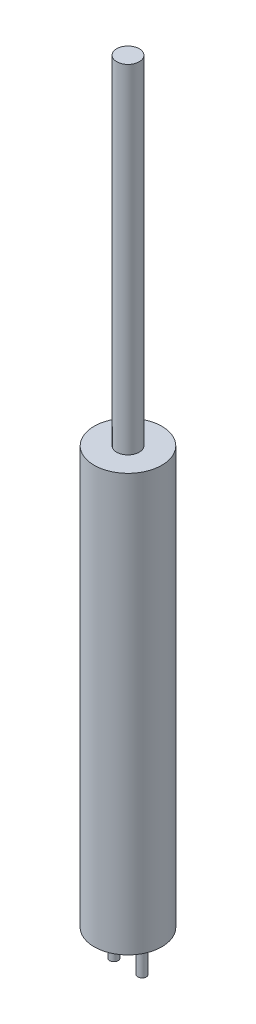
ISO-10303-21;
HEADER;
FILE_DESCRIPTION(('STEP AP214'),'2;1');
FILE_NAME('part.step','',(''),(''),'','','');
FILE_SCHEMA(('AUTOMOTIVE_DESIGN { 1 0 10303 214 1 1 1 1 }'));
ENDSEC;
DATA;
#1=APPLICATION_CONTEXT('core data for automotive mechanical design processes');
#2=APPLICATION_PROTOCOL_DEFINITION('international standard','automotive_design',2000,#1);
#3=PRODUCT_CONTEXT('',#1,'mechanical');
#4=PRODUCT('Part','Part','',(#3));
#5=PRODUCT_RELATED_PRODUCT_CATEGORY('part','',(#4));
#6=PRODUCT_DEFINITION_FORMATION('','',#4);
#7=PRODUCT_DEFINITION_CONTEXT('part definition',#1,'design');
#8=PRODUCT_DEFINITION('design','',#6,#7);
#9=PRODUCT_DEFINITION_SHAPE('','',#8);
#10=(LENGTH_UNIT() NAMED_UNIT(*) SI_UNIT(.MILLI.,.METRE.));
#11=(NAMED_UNIT(*) PLANE_ANGLE_UNIT() SI_UNIT($,.RADIAN.));
#12=(NAMED_UNIT(*) SI_UNIT($,.STERADIAN.) SOLID_ANGLE_UNIT());
#13=UNCERTAINTY_MEASURE_WITH_UNIT(LENGTH_MEASURE(1.E-05),#10,'distance_accuracy_value','');
#14=(GEOMETRIC_REPRESENTATION_CONTEXT(3) GLOBAL_UNCERTAINTY_ASSIGNED_CONTEXT((#13)) GLOBAL_UNIT_ASSIGNED_CONTEXT((#10,
#11,#12)) REPRESENTATION_CONTEXT('',''));
#15=CARTESIAN_POINT('',(0.,0.,0.));
#16=DIRECTION('',(0.,0.,1.));
#17=DIRECTION('',(1.,0.,0.));
#18=AXIS2_PLACEMENT_3D('',#15,#16,#17);
#19=CARTESIAN_POINT('',(-2.5,6.,0.));
#20=DIRECTION('',(0.,-1.,0.));
#21=DIRECTION('',(0.,0.,-1.));
#22=AXIS2_PLACEMENT_3D('',#19,#20,#21);
#23=CYLINDRICAL_SURFACE('',#22,0.75);
#24=CARTESIAN_POINT('',(-2.5,6.,0.));
#25=DIRECTION('',(0.,1.,0.));
#26=DIRECTION('',(0.,0.,1.));
#27=AXIS2_PLACEMENT_3D('',#24,#25,#26);
#28=CIRCLE('',#27,0.75);
#29=CARTESIAN_POINT('',(-2.5,6.,0.75));
#30=VERTEX_POINT('',#29);
#31=EDGE_CURVE('E58',#30,#30,#28,.T.);
#32=ORIENTED_EDGE('',*,*,#31,.F.);
#33=EDGE_LOOP('',(#32));
#34=FACE_BOUND('',#33,.T.);
#35=CARTESIAN_POINT('',(-2.5,0.,0.));
#36=DIRECTION('',(0.,1.,0.));
#37=DIRECTION('',(0.,0.,1.));
#38=AXIS2_PLACEMENT_3D('',#35,#36,#37);
#39=CIRCLE('',#38,0.75);
#40=CARTESIAN_POINT('',(-2.5,0.,0.75));
#41=VERTEX_POINT('',#40);
#42=EDGE_CURVE('E71',#41,#41,#39,.T.);
#43=ORIENTED_EDGE('',*,*,#42,.T.);
#44=EDGE_LOOP('',(#43));
#45=FACE_BOUND('',#44,.T.);
#46=ADVANCED_FACE('F50',(#34,#45),#23,.T.);
#47=CARTESIAN_POINT('',(-2.5,0.,0.));
#48=DIRECTION('',(0.,1.,0.));
#49=DIRECTION('',(0.,0.,1.));
#50=AXIS2_PLACEMENT_3D('',#47,#48,#49);
#51=PLANE('',#50);
#52=ORIENTED_EDGE('',*,*,#42,.F.);
#53=EDGE_LOOP('',(#52));
#54=FACE_BOUND('',#53,.T.);
#55=ADVANCED_FACE('F84',(#54),#51,.F.);
#56=CARTESIAN_POINT('',(0.,80.,0.));
#57=DIRECTION('',(0.,-1.,0.));
#58=DIRECTION('',(0.,0.,-1.));
#59=AXIS2_PLACEMENT_3D('',#56,#57,#58);
#60=CYLINDRICAL_SURFACE('',#59,6.);
#61=CARTESIAN_POINT('',(0.,80.,0.));
#62=DIRECTION('',(0.,1.,0.));
#63=DIRECTION('',(0.,0.,1.));
#64=AXIS2_PLACEMENT_3D('',#61,#62,#63);
#65=CIRCLE('',#64,6.);
#66=CARTESIAN_POINT('',(0.,80.,6.));
#67=VERTEX_POINT('',#66);
#68=EDGE_CURVE('E69',#67,#67,#65,.T.);
#69=ORIENTED_EDGE('',*,*,#68,.F.);
#70=EDGE_LOOP('',(#69));
#71=FACE_BOUND('',#70,.T.);
#72=CARTESIAN_POINT('',(0.,6.,0.));
#73=DIRECTION('',(0.,1.,0.));
#74=DIRECTION('',(0.,0.,1.));
#75=AXIS2_PLACEMENT_3D('',#72,#73,#74);
#76=CIRCLE('',#75,6.);
#77=CARTESIAN_POINT('',(0.,6.,6.));
#78=VERTEX_POINT('',#77);
#79=EDGE_CURVE('E68',#78,#78,#76,.T.);
#80=ORIENTED_EDGE('',*,*,#79,.T.);
#81=EDGE_LOOP('',(#80));
#82=FACE_BOUND('',#81,.T.);
#83=ADVANCED_FACE('F88',(#71,#82),#60,.T.);
#84=CARTESIAN_POINT('',(0.,80.,0.));
#85=DIRECTION('',(0.,1.,0.));
#86=DIRECTION('',(0.,0.,1.));
#87=AXIS2_PLACEMENT_3D('',#84,#85,#86);
#88=PLANE('',#87);
#89=CARTESIAN_POINT('',(0.,80.,0.));
#90=DIRECTION('',(0.,1.,0.));
#91=DIRECTION('',(0.,0.,1.));
#92=AXIS2_PLACEMENT_3D('',#89,#90,#91);
#93=CIRCLE('',#92,2.);
#94=CARTESIAN_POINT('',(0.,80.,2.));
#95=VERTEX_POINT('',#94);
#96=EDGE_CURVE('E10',#95,#95,#93,.T.);
#97=ORIENTED_EDGE('',*,*,#96,.F.);
#98=EDGE_LOOP('',(#97));
#99=FACE_BOUND('',#98,.T.);
#100=ORIENTED_EDGE('',*,*,#68,.T.);
#101=EDGE_LOOP('',(#100));
#102=FACE_BOUND('',#101,.T.);
#103=ADVANCED_FACE('F95',(#99,#102),#88,.T.);
#104=CARTESIAN_POINT('',(0.,6.,0.));
#105=DIRECTION('',(0.,1.,0.));
#106=DIRECTION('',(0.,0.,1.));
#107=AXIS2_PLACEMENT_3D('',#104,#105,#106);
#108=PLANE('',#107);
#109=CARTESIAN_POINT('',(2.5,6.,0.));
#110=DIRECTION('',(0.,1.,0.));
#111=DIRECTION('',(0.,0.,1.));
#112=AXIS2_PLACEMENT_3D('',#109,#110,#111);
#113=CIRCLE('',#112,0.75);
#114=CARTESIAN_POINT('',(2.5,6.,0.75));
#115=VERTEX_POINT('',#114);
#116=EDGE_CURVE('E49',#115,#115,#113,.F.);
#117=ORIENTED_EDGE('',*,*,#116,.F.);
#118=EDGE_LOOP('',(#117));
#119=FACE_BOUND('',#118,.T.);
#120=ORIENTED_EDGE('',*,*,#31,.T.);
#121=EDGE_LOOP('',(#120));
#122=FACE_BOUND('',#121,.T.);
#123=ORIENTED_EDGE('',*,*,#79,.F.);
#124=EDGE_LOOP('',(#123));
#125=FACE_BOUND('',#124,.T.);
#126=ADVANCED_FACE('F100',(#119,#122,#125),#108,.F.);
#127=CARTESIAN_POINT('',(2.5,6.,0.));
#128=DIRECTION('',(0.,-1.,0.));
#129=DIRECTION('',(0.,0.,-1.));
#130=AXIS2_PLACEMENT_3D('',#127,#128,#129);
#131=CYLINDRICAL_SURFACE('',#130,0.75);
#132=ORIENTED_EDGE('',*,*,#116,.T.);
#133=EDGE_LOOP('',(#132));
#134=FACE_BOUND('',#133,.T.);
#135=CARTESIAN_POINT('',(2.5,0.,0.));
#136=DIRECTION('',(0.,1.,0.));
#137=DIRECTION('',(0.,0.,1.));
#138=AXIS2_PLACEMENT_3D('',#135,#136,#137);
#139=CIRCLE('',#138,0.75);
#140=CARTESIAN_POINT('',(2.5,0.,0.75));
#141=VERTEX_POINT('',#140);
#142=EDGE_CURVE('E63',#141,#141,#139,.T.);
#143=ORIENTED_EDGE('',*,*,#142,.T.);
#144=EDGE_LOOP('',(#143));
#145=FACE_BOUND('',#144,.T.);
#146=ADVANCED_FACE('F99',(#134,#145),#131,.T.);
#147=CARTESIAN_POINT('',(2.5,0.,0.));
#148=DIRECTION('',(0.,1.,0.));
#149=DIRECTION('',(0.,0.,1.));
#150=AXIS2_PLACEMENT_3D('',#147,#148,#149);
#151=PLANE('',#150);
#152=ORIENTED_EDGE('',*,*,#142,.F.);
#153=EDGE_LOOP('',(#152));
#154=FACE_BOUND('',#153,.T.);
#155=ADVANCED_FACE('F106',(#154),#151,.F.);
#156=CARTESIAN_POINT('',(0.,140.,0.));
#157=DIRECTION('',(0.,-1.,0.));
#158=DIRECTION('',(0.,0.,-1.));
#159=AXIS2_PLACEMENT_3D('',#156,#157,#158);
#160=CYLINDRICAL_SURFACE('',#159,2.);
#161=CARTESIAN_POINT('',(0.,140.,0.));
#162=DIRECTION('',(0.,1.,0.));
#163=DIRECTION('',(0.,0.,1.));
#164=AXIS2_PLACEMENT_3D('',#161,#162,#163);
#165=CIRCLE('',#164,2.);
#166=CARTESIAN_POINT('',(0.,140.,2.));
#167=VERTEX_POINT('',#166);
#168=EDGE_CURVE('E62',#167,#167,#165,.T.);
#169=ORIENTED_EDGE('',*,*,#168,.F.);
#170=EDGE_LOOP('',(#169));
#171=FACE_BOUND('',#170,.T.);
#172=ORIENTED_EDGE('',*,*,#96,.T.);
#173=EDGE_LOOP('',(#172));
#174=FACE_BOUND('',#173,.T.);
#175=ADVANCED_FACE('F109',(#171,#174),#160,.T.);
#176=CARTESIAN_POINT('',(0.,140.,0.));
#177=DIRECTION('',(0.,1.,0.));
#178=DIRECTION('',(0.,0.,1.));
#179=AXIS2_PLACEMENT_3D('',#176,#177,#178);
#180=PLANE('',#179);
#181=ORIENTED_EDGE('',*,*,#168,.T.);
#182=EDGE_LOOP('',(#181));
#183=FACE_BOUND('',#182,.T.);
#184=ADVANCED_FACE('F111',(#183),#180,.T.);
#185=CLOSED_SHELL('',(#46,#55,#83,#103,#126,#146,#155,#175,#184));
#186=MANIFOLD_SOLID_BREP('B2',#185);
#187=ADVANCED_BREP_SHAPE_REPRESENTATION('',(#18,#186),#14);
#188=SHAPE_DEFINITION_REPRESENTATION(#9,#187);
ENDSEC;
END-ISO-10303-21;
